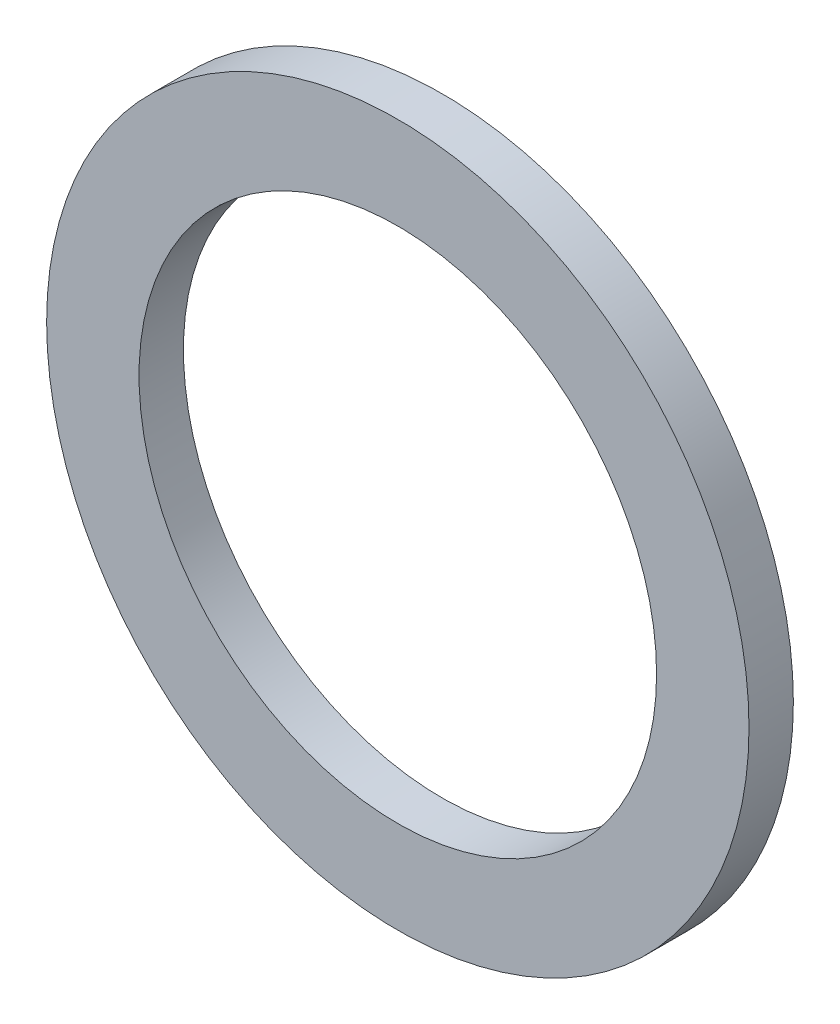
ISO-10303-21;
HEADER;
FILE_DESCRIPTION(('STEP AP214'),'2;1');
FILE_NAME('part.step','',(''),(''),'','','');
FILE_SCHEMA(('AUTOMOTIVE_DESIGN { 1 0 10303 214 1 1 1 1 }'));
ENDSEC;
DATA;
#1=APPLICATION_CONTEXT('core data for automotive mechanical design processes');
#2=APPLICATION_PROTOCOL_DEFINITION('international standard','automotive_design',2000,#1);
#3=PRODUCT_CONTEXT('',#1,'mechanical');
#4=PRODUCT('Part','Part','',(#3));
#5=PRODUCT_RELATED_PRODUCT_CATEGORY('part','',(#4));
#6=PRODUCT_DEFINITION_FORMATION('','',#4);
#7=PRODUCT_DEFINITION_CONTEXT('part definition',#1,'design');
#8=PRODUCT_DEFINITION('design','',#6,#7);
#9=PRODUCT_DEFINITION_SHAPE('','',#8);
#10=(LENGTH_UNIT() NAMED_UNIT(*) SI_UNIT(.MILLI.,.METRE.));
#11=(NAMED_UNIT(*) PLANE_ANGLE_UNIT() SI_UNIT($,.RADIAN.));
#12=(NAMED_UNIT(*) SI_UNIT($,.STERADIAN.) SOLID_ANGLE_UNIT());
#13=UNCERTAINTY_MEASURE_WITH_UNIT(LENGTH_MEASURE(1.E-05),#10,'distance_accuracy_value','');
#14=(GEOMETRIC_REPRESENTATION_CONTEXT(3) GLOBAL_UNCERTAINTY_ASSIGNED_CONTEXT((#13)) GLOBAL_UNIT_ASSIGNED_CONTEXT((#10,
#11,#12)) REPRESENTATION_CONTEXT('',''));
#15=CARTESIAN_POINT('',(0.,0.,0.));
#16=DIRECTION('',(0.,0.,1.));
#17=DIRECTION('',(1.,0.,0.));
#18=AXIS2_PLACEMENT_3D('',#15,#16,#17);
#19=CARTESIAN_POINT('',(0.,0.,6.));
#20=DIRECTION('',(0.,0.,1.));
#21=DIRECTION('',(1.,0.,0.));
#22=AXIS2_PLACEMENT_3D('',#19,#20,#21);
#23=PLANE('',#22);
#24=CARTESIAN_POINT('',(0.,0.,6.));
#25=DIRECTION('',(0.,0.,1.));
#26=DIRECTION('',(1.,0.,0.));
#27=AXIS2_PLACEMENT_3D('',#24,#25,#26);
#28=CIRCLE('',#27,47.5);
#29=CARTESIAN_POINT('',(47.5,0.,6.));
#30=VERTEX_POINT('',#29);
#31=EDGE_CURVE('E10',#30,#30,#28,.T.);
#32=ORIENTED_EDGE('',*,*,#31,.T.);
#33=EDGE_LOOP('',(#32));
#34=FACE_BOUND('',#33,.T.);
#35=CARTESIAN_POINT('',(0.,0.,6.));
#36=DIRECTION('',(0.,0.,1.));
#37=DIRECTION('',(1.,0.,0.));
#38=AXIS2_PLACEMENT_3D('',#35,#36,#37);
#39=CIRCLE('',#38,35.);
#40=CARTESIAN_POINT('',(35.,0.,6.));
#41=VERTEX_POINT('',#40);
#42=EDGE_CURVE('E50',#41,#41,#39,.T.);
#43=ORIENTED_EDGE('',*,*,#42,.F.);
#44=EDGE_LOOP('',(#43));
#45=FACE_BOUND('',#44,.T.);
#46=ADVANCED_FACE('F37',(#34,#45),#23,.T.);
#47=CARTESIAN_POINT('',(0.,0.,0.));
#48=DIRECTION('',(0.,0.,1.));
#49=DIRECTION('',(1.,0.,0.));
#50=AXIS2_PLACEMENT_3D('',#47,#48,#49);
#51=PLANE('',#50);
#52=CARTESIAN_POINT('',(0.,0.,0.));
#53=DIRECTION('',(0.,0.,1.));
#54=DIRECTION('',(1.,0.,0.));
#55=AXIS2_PLACEMENT_3D('',#52,#53,#54);
#56=CIRCLE('',#55,47.5);
#57=CARTESIAN_POINT('',(47.5,0.,0.));
#58=VERTEX_POINT('',#57);
#59=EDGE_CURVE('E41',#58,#58,#56,.T.);
#60=ORIENTED_EDGE('',*,*,#59,.F.);
#61=EDGE_LOOP('',(#60));
#62=FACE_BOUND('',#61,.T.);
#63=CARTESIAN_POINT('',(0.,0.,0.));
#64=DIRECTION('',(0.,0.,1.));
#65=DIRECTION('',(1.,0.,0.));
#66=AXIS2_PLACEMENT_3D('',#63,#64,#65);
#67=CIRCLE('',#66,35.);
#68=CARTESIAN_POINT('',(35.,0.,0.));
#69=VERTEX_POINT('',#68);
#70=EDGE_CURVE('E52',#69,#69,#67,.T.);
#71=ORIENTED_EDGE('',*,*,#70,.T.);
#72=EDGE_LOOP('',(#71));
#73=FACE_BOUND('',#72,.T.);
#74=ADVANCED_FACE('F64',(#62,#73),#51,.F.);
#75=CARTESIAN_POINT('',(0.,0.,6.));
#76=DIRECTION('',(0.,0.,-1.));
#77=DIRECTION('',(-1.,0.,0.));
#78=AXIS2_PLACEMENT_3D('',#75,#76,#77);
#79=CYLINDRICAL_SURFACE('',#78,47.5);
#80=ORIENTED_EDGE('',*,*,#31,.F.);
#81=EDGE_LOOP('',(#80));
#82=FACE_BOUND('',#81,.T.);
#83=ORIENTED_EDGE('',*,*,#59,.T.);
#84=EDGE_LOOP('',(#83));
#85=FACE_BOUND('',#84,.T.);
#86=ADVANCED_FACE('F39',(#82,#85),#79,.T.);
#87=CARTESIAN_POINT('',(0.,0.,6.));
#88=DIRECTION('',(0.,0.,-1.));
#89=DIRECTION('',(-1.,0.,0.));
#90=AXIS2_PLACEMENT_3D('',#87,#88,#89);
#91=CYLINDRICAL_SURFACE('',#90,35.);
#92=ORIENTED_EDGE('',*,*,#42,.T.);
#93=EDGE_LOOP('',(#92));
#94=FACE_BOUND('',#93,.T.);
#95=ORIENTED_EDGE('',*,*,#70,.F.);
#96=EDGE_LOOP('',(#95));
#97=FACE_BOUND('',#96,.T.);
#98=ADVANCED_FACE('F60',(#94,#97),#91,.F.);
#99=CLOSED_SHELL('',(#46,#74,#86,#98));
#100=MANIFOLD_SOLID_BREP('B2',#99);
#101=ADVANCED_BREP_SHAPE_REPRESENTATION('',(#18,#100),#14);
#102=SHAPE_DEFINITION_REPRESENTATION(#9,#101);
ENDSEC;
END-ISO-10303-21;
